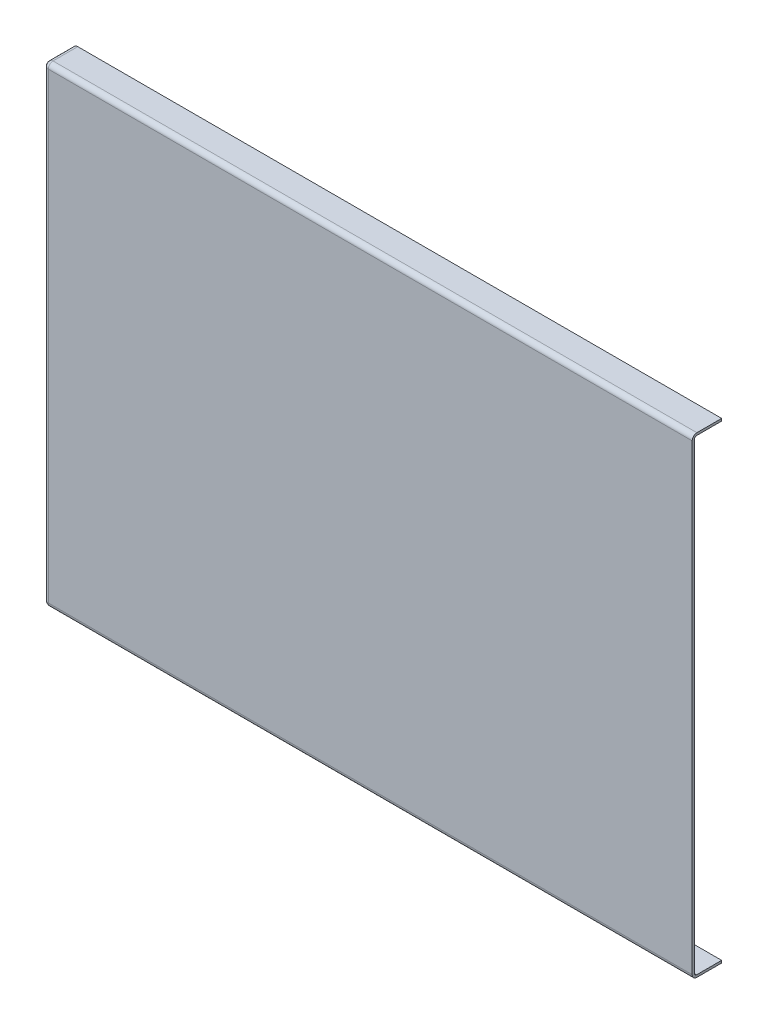
ISO-10303-21;
HEADER;
FILE_DESCRIPTION(('STEP AP214'),'2;1');
FILE_NAME('part.step','',(''),(''),'','','');
FILE_SCHEMA(('AUTOMOTIVE_DESIGN { 1 0 10303 214 1 1 1 1 }'));
ENDSEC;
DATA;
#1=APPLICATION_CONTEXT('core data for automotive mechanical design processes');
#2=APPLICATION_PROTOCOL_DEFINITION('international standard','automotive_design',2000,#1);
#3=PRODUCT_CONTEXT('',#1,'mechanical');
#4=PRODUCT('Part','Part','',(#3));
#5=PRODUCT_RELATED_PRODUCT_CATEGORY('part','',(#4));
#6=PRODUCT_DEFINITION_FORMATION('','',#4);
#7=PRODUCT_DEFINITION_CONTEXT('part definition',#1,'design');
#8=PRODUCT_DEFINITION('design','',#6,#7);
#9=PRODUCT_DEFINITION_SHAPE('','',#8);
#10=(LENGTH_UNIT() NAMED_UNIT(*) SI_UNIT(.MILLI.,.METRE.));
#11=(NAMED_UNIT(*) PLANE_ANGLE_UNIT() SI_UNIT($,.RADIAN.));
#12=(NAMED_UNIT(*) SI_UNIT($,.STERADIAN.) SOLID_ANGLE_UNIT());
#13=UNCERTAINTY_MEASURE_WITH_UNIT(LENGTH_MEASURE(1.E-05),#10,'distance_accuracy_value','');
#14=(GEOMETRIC_REPRESENTATION_CONTEXT(3) GLOBAL_UNCERTAINTY_ASSIGNED_CONTEXT((#13)) GLOBAL_UNIT_ASSIGNED_CONTEXT((#10,
#11,#12)) REPRESENTATION_CONTEXT('',''));
#15=CARTESIAN_POINT('',(0.,0.,0.));
#16=DIRECTION('',(0.,0.,1.));
#17=DIRECTION('',(1.,0.,0.));
#18=AXIS2_PLACEMENT_3D('',#15,#16,#17);
#19=CARTESIAN_POINT('',(0.,400.,-25.));
#20=DIRECTION('',(0.,0.,-1.));
#21=DIRECTION('',(-1.,0.,0.));
#22=AXIS2_PLACEMENT_3D('',#19,#20,#21);
#23=PLANE('',#22);
#24=DIRECTION('',(0.,1.,0.));
#25=VECTOR('',#24,1.);
#26=CARTESIAN_POINT('',(550.,0.,-25.));
#27=LINE('',#26,#25);
#28=CARTESIAN_POINT('',(550.,398.,-25.));
#29=VERTEX_POINT('',#28);
#30=CARTESIAN_POINT('',(550.,400.,-25.));
#31=VERTEX_POINT('',#30);
#32=EDGE_CURVE('E220',#29,#31,#27,.T.);
#33=ORIENTED_EDGE('',*,*,#32,.F.);
#34=DIRECTION('',(-1.,0.,0.));
#35=VECTOR('',#34,1.);
#36=CARTESIAN_POINT('',(0.,398.,-25.));
#37=LINE('',#36,#35);
#38=CARTESIAN_POINT('',(4.,398.,-25.));
#39=VERTEX_POINT('',#38);
#40=EDGE_CURVE('E197',#29,#39,#37,.T.);
#41=ORIENTED_EDGE('',*,*,#40,.T.);
#42=CARTESIAN_POINT('',(4.,396.,-25.));
#43=DIRECTION('',(0.,0.,-1.));
#44=DIRECTION('',(-1.,0.,0.));
#45=AXIS2_PLACEMENT_3D('',#42,#43,#44);
#46=CIRCLE('',#45,2.);
#47=CARTESIAN_POINT('',(2.,396.,-25.));
#48=VERTEX_POINT('',#47);
#49=EDGE_CURVE('E194',#48,#39,#46,.T.);
#50=ORIENTED_EDGE('',*,*,#49,.F.);
#51=DIRECTION('',(0.,-1.,0.));
#52=VECTOR('',#51,1.);
#53=CARTESIAN_POINT('',(2.,0.,-25.));
#54=LINE('',#53,#52);
#55=CARTESIAN_POINT('',(2.,4.,-25.));
#56=VERTEX_POINT('',#55);
#57=EDGE_CURVE('E166',#48,#56,#54,.T.);
#58=ORIENTED_EDGE('',*,*,#57,.T.);
#59=CARTESIAN_POINT('',(4.,4.,-25.));
#60=DIRECTION('',(0.,0.,-1.));
#61=DIRECTION('',(-1.,0.,0.));
#62=AXIS2_PLACEMENT_3D('',#59,#60,#61);
#63=CIRCLE('',#62,2.);
#64=CARTESIAN_POINT('',(4.,2.,-25.));
#65=VERTEX_POINT('',#64);
#66=EDGE_CURVE('E170',#65,#56,#63,.T.);
#67=ORIENTED_EDGE('',*,*,#66,.F.);
#68=DIRECTION('',(1.,0.,0.));
#69=VECTOR('',#68,1.);
#70=CARTESIAN_POINT('',(0.,2.,-25.));
#71=LINE('',#70,#69);
#72=CARTESIAN_POINT('',(550.,2.,-25.));
#73=VERTEX_POINT('',#72);
#74=EDGE_CURVE('E50',#65,#73,#71,.T.);
#75=ORIENTED_EDGE('',*,*,#74,.T.);
#76=CARTESIAN_POINT('',(550.,0.,-25.));
#77=VERTEX_POINT('',#76);
#78=EDGE_CURVE('E221',#77,#73,#27,.T.);
#79=ORIENTED_EDGE('',*,*,#78,.F.);
#80=DIRECTION('',(1.,0.,0.));
#81=VECTOR('',#80,1.);
#82=CARTESIAN_POINT('',(0.,0.,-25.));
#83=LINE('',#82,#81);
#84=CARTESIAN_POINT('',(4.,0.,-25.));
#85=VERTEX_POINT('',#84);
#86=EDGE_CURVE('E217',#85,#77,#83,.T.);
#87=ORIENTED_EDGE('',*,*,#86,.F.);
#88=CARTESIAN_POINT('',(4.,4.,-25.));
#89=DIRECTION('',(0.,0.,-1.));
#90=DIRECTION('',(-1.,0.,0.));
#91=AXIS2_PLACEMENT_3D('',#88,#89,#90);
#92=CIRCLE('',#91,4.);
#93=CARTESIAN_POINT('',(0.,4.,-25.));
#94=VERTEX_POINT('',#93);
#95=EDGE_CURVE('E255',#85,#94,#92,.T.);
#96=ORIENTED_EDGE('',*,*,#95,.T.);
#97=DIRECTION('',(0.,-1.,0.));
#98=VECTOR('',#97,1.);
#99=CARTESIAN_POINT('',(0.,0.,-25.));
#100=LINE('',#99,#98);
#101=CARTESIAN_POINT('',(0.,396.,-25.));
#102=VERTEX_POINT('',#101);
#103=EDGE_CURVE('E214',#102,#94,#100,.T.);
#104=ORIENTED_EDGE('',*,*,#103,.F.);
#105=CARTESIAN_POINT('',(4.,396.,-25.));
#106=DIRECTION('',(0.,0.,-1.));
#107=DIRECTION('',(-1.,0.,0.));
#108=AXIS2_PLACEMENT_3D('',#105,#106,#107);
#109=CIRCLE('',#108,4.);
#110=CARTESIAN_POINT('',(4.,400.,-25.));
#111=VERTEX_POINT('',#110);
#112=EDGE_CURVE('E257',#102,#111,#109,.T.);
#113=ORIENTED_EDGE('',*,*,#112,.T.);
#114=DIRECTION('',(-1.,0.,0.));
#115=VECTOR('',#114,1.);
#116=CARTESIAN_POINT('',(0.,400.,-25.));
#117=LINE('',#116,#115);
#118=EDGE_CURVE('E224',#31,#111,#117,.T.);
#119=ORIENTED_EDGE('',*,*,#118,.F.);
#120=EDGE_LOOP('',(#33,#41,#50,#58,#67,#75,#79,#87,#96,#104,#113,#119));
#121=FACE_BOUND('',#120,.T.);
#122=ADVANCED_FACE('F33',(#121),#23,.T.);
#123=CARTESIAN_POINT('',(0.,0.,-25.));
#124=DIRECTION('',(-1.,0.,0.));
#125=DIRECTION('',(0.,0.,1.));
#126=AXIS2_PLACEMENT_3D('',#123,#124,#125);
#127=PLANE('',#126);
#128=DIRECTION('',(0.,-1.,0.));
#129=VECTOR('',#128,1.);
#130=CARTESIAN_POINT('',(0.,400.,-4.));
#131=LINE('',#130,#129);
#132=CARTESIAN_POINT('',(0.,4.,-4.));
#133=VERTEX_POINT('',#132);
#134=CARTESIAN_POINT('',(0.,396.,-4.));
#135=VERTEX_POINT('',#134);
#136=EDGE_CURVE('E249',#133,#135,#131,.F.);
#137=ORIENTED_EDGE('',*,*,#136,.T.);
#138=DIRECTION('',(0.,0.,1.));
#139=VECTOR('',#138,1.);
#140=CARTESIAN_POINT('',(0.,396.,-25.));
#141=LINE('',#140,#139);
#142=EDGE_CURVE('E253',#135,#102,#141,.F.);
#143=ORIENTED_EDGE('',*,*,#142,.T.);
#144=ORIENTED_EDGE('',*,*,#103,.T.);
#145=DIRECTION('',(0.,0.,1.));
#146=VECTOR('',#145,1.);
#147=CARTESIAN_POINT('',(0.,4.,-25.));
#148=LINE('',#147,#146);
#149=EDGE_CURVE('E251',#94,#133,#148,.T.);
#150=ORIENTED_EDGE('',*,*,#149,.T.);
#151=EDGE_LOOP('',(#137,#143,#144,#150));
#152=FACE_BOUND('',#151,.T.);
#153=ADVANCED_FACE('F288',(#152),#127,.T.);
#154=CARTESIAN_POINT('',(0.,400.,-25.));
#155=DIRECTION('',(0.,1.,0.));
#156=DIRECTION('',(0.,0.,1.));
#157=AXIS2_PLACEMENT_3D('',#154,#155,#156);
#158=PLANE('',#157);
#159=DIRECTION('',(0.,0.,1.));
#160=VECTOR('',#159,1.);
#161=CARTESIAN_POINT('',(4.,400.,-25.));
#162=LINE('',#161,#160);
#163=CARTESIAN_POINT('',(4.,400.,-4.));
#164=VERTEX_POINT('',#163);
#165=EDGE_CURVE('E241',#111,#164,#162,.T.);
#166=ORIENTED_EDGE('',*,*,#165,.T.);
#167=DIRECTION('',(-1.,0.,0.));
#168=VECTOR('',#167,1.);
#169=CARTESIAN_POINT('',(550.,400.,-4.));
#170=LINE('',#169,#168);
#171=CARTESIAN_POINT('',(550.,400.,-4.));
#172=VERTEX_POINT('',#171);
#173=EDGE_CURVE('E243',#164,#172,#170,.F.);
#174=ORIENTED_EDGE('',*,*,#173,.T.);
#175=DIRECTION('',(0.,0.,1.));
#176=VECTOR('',#175,1.);
#177=CARTESIAN_POINT('',(550.,400.,-25.));
#178=LINE('',#177,#176);
#179=EDGE_CURVE('E230',#31,#172,#178,.T.);
#180=ORIENTED_EDGE('',*,*,#179,.F.);
#181=ORIENTED_EDGE('',*,*,#118,.T.);
#182=EDGE_LOOP('',(#166,#174,#180,#181));
#183=FACE_BOUND('',#182,.T.);
#184=ADVANCED_FACE('F302',(#183),#158,.T.);
#185=CARTESIAN_POINT('',(550.,0.,-25.));
#186=DIRECTION('',(1.,0.,0.));
#187=DIRECTION('',(0.,0.,-1.));
#188=AXIS2_PLACEMENT_3D('',#185,#186,#187);
#189=PLANE('',#188);
#190=DIRECTION('',(0.,0.,1.));
#191=VECTOR('',#190,1.);
#192=CARTESIAN_POINT('',(550.,398.,-25.));
#193=LINE('',#192,#191);
#194=CARTESIAN_POINT('',(550.,398.,-4.));
#195=VERTEX_POINT('',#194);
#196=EDGE_CURVE('E201',#29,#195,#193,.T.);
#197=ORIENTED_EDGE('',*,*,#196,.F.);
#198=ORIENTED_EDGE('',*,*,#32,.T.);
#199=ORIENTED_EDGE('',*,*,#179,.T.);
#200=CARTESIAN_POINT('',(550.,396.,-4.));
#201=DIRECTION('',(1.,0.,0.));
#202=DIRECTION('',(0.,0.,-1.));
#203=AXIS2_PLACEMENT_3D('',#200,#201,#202);
#204=CIRCLE('',#203,4.);
#205=CARTESIAN_POINT('',(550.,396.,0.));
#206=VERTEX_POINT('',#205);
#207=EDGE_CURVE('E247',#172,#206,#204,.T.);
#208=ORIENTED_EDGE('',*,*,#207,.T.);
#209=DIRECTION('',(0.,1.,0.));
#210=VECTOR('',#209,1.);
#211=CARTESIAN_POINT('',(550.,0.,0.));
#212=LINE('',#211,#210);
#213=CARTESIAN_POINT('',(550.,4.,0.));
#214=VERTEX_POINT('',#213);
#215=EDGE_CURVE('E218',#214,#206,#212,.T.);
#216=ORIENTED_EDGE('',*,*,#215,.F.);
#217=CARTESIAN_POINT('',(550.,4.,-4.));
#218=DIRECTION('',(1.,0.,0.));
#219=DIRECTION('',(0.,0.,-1.));
#220=AXIS2_PLACEMENT_3D('',#217,#218,#219);
#221=CIRCLE('',#220,4.);
#222=CARTESIAN_POINT('',(550.,0.,-4.));
#223=VERTEX_POINT('',#222);
#224=EDGE_CURVE('E245',#214,#223,#221,.T.);
#225=ORIENTED_EDGE('',*,*,#224,.T.);
#226=DIRECTION('',(0.,0.,1.));
#227=VECTOR('',#226,1.);
#228=CARTESIAN_POINT('',(550.,0.,-25.));
#229=LINE('',#228,#227);
#230=EDGE_CURVE('E227',#77,#223,#229,.T.);
#231=ORIENTED_EDGE('',*,*,#230,.F.);
#232=ORIENTED_EDGE('',*,*,#78,.T.);
#233=DIRECTION('',(0.,0.,1.));
#234=VECTOR('',#233,1.);
#235=CARTESIAN_POINT('',(550.,2.,-25.));
#236=LINE('',#235,#234);
#237=CARTESIAN_POINT('',(550.,2.,-4.));
#238=VERTEX_POINT('',#237);
#239=EDGE_CURVE('E200',#73,#238,#236,.T.);
#240=ORIENTED_EDGE('',*,*,#239,.T.);
#241=CARTESIAN_POINT('',(550.,4.,-4.));
#242=DIRECTION('',(1.,0.,0.));
#243=DIRECTION('',(0.,0.,-1.));
#244=AXIS2_PLACEMENT_3D('',#241,#242,#243);
#245=CIRCLE('',#244,2.);
#246=CARTESIAN_POINT('',(550.,4.,-2.));
#247=VERTEX_POINT('',#246);
#248=EDGE_CURVE('E190',#247,#238,#245,.T.);
#249=ORIENTED_EDGE('',*,*,#248,.F.);
#250=DIRECTION('',(0.,1.,0.));
#251=VECTOR('',#250,1.);
#252=CARTESIAN_POINT('',(550.,0.,-2.));
#253=LINE('',#252,#251);
#254=CARTESIAN_POINT('',(550.,396.,-2.));
#255=VERTEX_POINT('',#254);
#256=EDGE_CURVE('E193',#247,#255,#253,.T.);
#257=ORIENTED_EDGE('',*,*,#256,.T.);
#258=CARTESIAN_POINT('',(550.,396.,-4.));
#259=DIRECTION('',(1.,0.,0.));
#260=DIRECTION('',(0.,0.,-1.));
#261=AXIS2_PLACEMENT_3D('',#258,#259,#260);
#262=CIRCLE('',#261,2.);
#263=EDGE_CURVE('E160',#195,#255,#262,.T.);
#264=ORIENTED_EDGE('',*,*,#263,.F.);
#265=EDGE_LOOP('',(#197,#198,#199,#208,#216,#225,#231,#232,#240,#249,#257,#264));
#266=FACE_BOUND('',#265,.T.);
#267=ADVANCED_FACE('F306',(#266),#189,.T.);
#268=CARTESIAN_POINT('',(0.,0.,-25.));
#269=DIRECTION('',(0.,-1.,0.));
#270=DIRECTION('',(0.,0.,-1.));
#271=AXIS2_PLACEMENT_3D('',#268,#269,#270);
#272=PLANE('',#271);
#273=DIRECTION('',(1.,0.,0.));
#274=VECTOR('',#273,1.);
#275=CARTESIAN_POINT('',(0.,0.,-4.));
#276=LINE('',#275,#274);
#277=CARTESIAN_POINT('',(4.,0.,-4.));
#278=VERTEX_POINT('',#277);
#279=EDGE_CURVE('E42',#223,#278,#276,.F.);
#280=ORIENTED_EDGE('',*,*,#279,.T.);
#281=DIRECTION('',(0.,0.,1.));
#282=VECTOR('',#281,1.);
#283=CARTESIAN_POINT('',(4.,0.,-25.));
#284=LINE('',#283,#282);
#285=EDGE_CURVE('E11',#278,#85,#284,.F.);
#286=ORIENTED_EDGE('',*,*,#285,.T.);
#287=ORIENTED_EDGE('',*,*,#86,.T.);
#288=ORIENTED_EDGE('',*,*,#230,.T.);
#289=EDGE_LOOP('',(#280,#286,#287,#288));
#290=FACE_BOUND('',#289,.T.);
#291=ADVANCED_FACE('F323',(#290),#272,.T.);
#292=CARTESIAN_POINT('',(0.,400.,0.));
#293=DIRECTION('',(0.,0.,-1.));
#294=DIRECTION('',(-1.,0.,0.));
#295=AXIS2_PLACEMENT_3D('',#292,#293,#294);
#296=PLANE('',#295);
#297=ORIENTED_EDGE('',*,*,#215,.T.);
#298=DIRECTION('',(-1.,0.,0.));
#299=VECTOR('',#298,1.);
#300=CARTESIAN_POINT('',(0.,396.,0.));
#301=LINE('',#300,#299);
#302=CARTESIAN_POINT('',(4.,396.,0.));
#303=VERTEX_POINT('',#302);
#304=EDGE_CURVE('E238',#206,#303,#301,.T.);
#305=ORIENTED_EDGE('',*,*,#304,.T.);
#306=DIRECTION('',(0.,-1.,0.));
#307=VECTOR('',#306,1.);
#308=CARTESIAN_POINT('',(4.,0.,0.));
#309=LINE('',#308,#307);
#310=CARTESIAN_POINT('',(4.,4.,0.));
#311=VERTEX_POINT('',#310);
#312=EDGE_CURVE('E233',#303,#311,#309,.T.);
#313=ORIENTED_EDGE('',*,*,#312,.T.);
#314=DIRECTION('',(1.,0.,0.));
#315=VECTOR('',#314,1.);
#316=CARTESIAN_POINT('',(550.,4.,0.));
#317=LINE('',#316,#315);
#318=EDGE_CURVE('E236',#311,#214,#317,.T.);
#319=ORIENTED_EDGE('',*,*,#318,.T.);
#320=EDGE_LOOP('',(#297,#305,#313,#319));
#321=FACE_BOUND('',#320,.T.);
#322=ADVANCED_FACE('F313',(#321),#296,.F.);
#323=CARTESIAN_POINT('',(0.,4.,-4.));
#324=DIRECTION('',(-1.,0.,0.));
#325=DIRECTION('',(0.,0.,1.));
#326=AXIS2_PLACEMENT_3D('',#323,#324,#325);
#327=CYLINDRICAL_SURFACE('',#326,4.);
#328=ORIENTED_EDGE('',*,*,#224,.F.);
#329=ORIENTED_EDGE('',*,*,#318,.F.);
#330=CARTESIAN_POINT('',(4.,4.,-4.));
#331=DIRECTION('',(-1.,0.,0.));
#332=DIRECTION('',(0.,0.,1.));
#333=AXIS2_PLACEMENT_3D('',#330,#331,#332);
#334=CIRCLE('',#333,4.);
#335=EDGE_CURVE('E37',#278,#311,#334,.T.);
#336=ORIENTED_EDGE('',*,*,#335,.F.);
#337=ORIENTED_EDGE('',*,*,#279,.F.);
#338=EDGE_LOOP('',(#328,#329,#336,#337));
#339=FACE_BOUND('',#338,.T.);
#340=ADVANCED_FACE('F35',(#339),#327,.T.);
#341=CARTESIAN_POINT('',(4.,4.,-25.));
#342=DIRECTION('',(0.,0.,1.));
#343=DIRECTION('',(1.,0.,0.));
#344=AXIS2_PLACEMENT_3D('',#341,#342,#343);
#345=CYLINDRICAL_SURFACE('',#344,4.);
#346=ORIENTED_EDGE('',*,*,#95,.F.);
#347=ORIENTED_EDGE('',*,*,#285,.F.);
#348=CARTESIAN_POINT('',(4.,4.,-4.));
#349=DIRECTION('',(0.,0.,1.));
#350=DIRECTION('',(1.,0.,0.));
#351=AXIS2_PLACEMENT_3D('',#348,#349,#350);
#352=CIRCLE('',#351,4.);
#353=EDGE_CURVE('E271',#133,#278,#352,.T.);
#354=ORIENTED_EDGE('',*,*,#353,.F.);
#355=ORIENTED_EDGE('',*,*,#149,.F.);
#356=EDGE_LOOP('',(#346,#347,#354,#355));
#357=FACE_BOUND('',#356,.T.);
#358=ADVANCED_FACE('F317',(#357),#345,.T.);
#359=CARTESIAN_POINT('',(4.,4.,-4.));
#360=DIRECTION('',(0.,0.,1.));
#361=DIRECTION('',(1.,0.,0.));
#362=AXIS2_PLACEMENT_3D('',#359,#360,#361);
#363=SPHERICAL_SURFACE('',#362,4.);
#364=ORIENTED_EDGE('',*,*,#353,.T.);
#365=ORIENTED_EDGE('',*,*,#335,.T.);
#366=CARTESIAN_POINT('',(4.,4.,-4.));
#367=DIRECTION('',(0.,-1.,0.));
#368=DIRECTION('',(1.,0.,0.));
#369=AXIS2_PLACEMENT_3D('',#366,#367,#368);
#370=CIRCLE('',#369,4.);
#371=EDGE_CURVE('E269',#133,#311,#370,.F.);
#372=ORIENTED_EDGE('',*,*,#371,.F.);
#373=EDGE_LOOP('',(#364,#365,#372));
#374=FACE_BOUND('',#373,.T.);
#375=ADVANCED_FACE('F278',(#374),#363,.T.);
#376=CARTESIAN_POINT('',(4.,400.,-4.));
#377=DIRECTION('',(0.,1.,0.));
#378=DIRECTION('',(0.,0.,1.));
#379=AXIS2_PLACEMENT_3D('',#376,#377,#378);
#380=CYLINDRICAL_SURFACE('',#379,4.);
#381=ORIENTED_EDGE('',*,*,#371,.T.);
#382=ORIENTED_EDGE('',*,*,#312,.F.);
#383=CARTESIAN_POINT('',(4.,396.,-4.));
#384=DIRECTION('',(0.,1.,0.));
#385=DIRECTION('',(0.,0.,1.));
#386=AXIS2_PLACEMENT_3D('',#383,#384,#385);
#387=CIRCLE('',#386,4.);
#388=EDGE_CURVE('E266',#135,#303,#387,.T.);
#389=ORIENTED_EDGE('',*,*,#388,.F.);
#390=ORIENTED_EDGE('',*,*,#136,.F.);
#391=EDGE_LOOP('',(#381,#382,#389,#390));
#392=FACE_BOUND('',#391,.T.);
#393=ADVANCED_FACE('F284',(#392),#380,.T.);
#394=CARTESIAN_POINT('',(4.,396.,-25.));
#395=DIRECTION('',(0.,0.,1.));
#396=DIRECTION('',(1.,0.,0.));
#397=AXIS2_PLACEMENT_3D('',#394,#395,#396);
#398=CYLINDRICAL_SURFACE('',#397,4.);
#399=ORIENTED_EDGE('',*,*,#112,.F.);
#400=ORIENTED_EDGE('',*,*,#142,.F.);
#401=CARTESIAN_POINT('',(4.,396.,-4.));
#402=DIRECTION('',(0.,0.,1.));
#403=DIRECTION('',(1.,0.,0.));
#404=AXIS2_PLACEMENT_3D('',#401,#402,#403);
#405=CIRCLE('',#404,4.);
#406=EDGE_CURVE('E262',#164,#135,#405,.T.);
#407=ORIENTED_EDGE('',*,*,#406,.F.);
#408=ORIENTED_EDGE('',*,*,#165,.F.);
#409=EDGE_LOOP('',(#399,#400,#407,#408));
#410=FACE_BOUND('',#409,.T.);
#411=ADVANCED_FACE('F294',(#410),#398,.T.);
#412=CARTESIAN_POINT('',(4.,396.,-4.));
#413=DIRECTION('',(0.,0.,1.));
#414=DIRECTION('',(1.,0.,0.));
#415=AXIS2_PLACEMENT_3D('',#412,#413,#414);
#416=SPHERICAL_SURFACE('',#415,4.);
#417=ORIENTED_EDGE('',*,*,#406,.T.);
#418=ORIENTED_EDGE('',*,*,#388,.T.);
#419=CARTESIAN_POINT('',(4.,396.,-4.));
#420=DIRECTION('',(-1.,0.,0.));
#421=DIRECTION('',(0.,0.,1.));
#422=AXIS2_PLACEMENT_3D('',#419,#420,#421);
#423=CIRCLE('',#422,4.);
#424=EDGE_CURVE('E260',#164,#303,#423,.F.);
#425=ORIENTED_EDGE('',*,*,#424,.F.);
#426=EDGE_LOOP('',(#417,#418,#425));
#427=FACE_BOUND('',#426,.T.);
#428=ADVANCED_FACE('F343',(#427),#416,.T.);
#429=CARTESIAN_POINT('',(0.,396.,-4.));
#430=DIRECTION('',(1.,0.,0.));
#431=DIRECTION('',(0.,0.,-1.));
#432=AXIS2_PLACEMENT_3D('',#429,#430,#431);
#433=CYLINDRICAL_SURFACE('',#432,4.);
#434=ORIENTED_EDGE('',*,*,#207,.F.);
#435=ORIENTED_EDGE('',*,*,#173,.F.);
#436=ORIENTED_EDGE('',*,*,#424,.T.);
#437=ORIENTED_EDGE('',*,*,#304,.F.);
#438=EDGE_LOOP('',(#434,#435,#436,#437));
#439=FACE_BOUND('',#438,.T.);
#440=ADVANCED_FACE('F310',(#439),#433,.T.);
#441=CARTESIAN_POINT('',(2.,0.,-25.));
#442=DIRECTION('',(-1.,0.,0.));
#443=DIRECTION('',(0.,0.,1.));
#444=AXIS2_PLACEMENT_3D('',#441,#442,#443);
#445=PLANE('',#444);
#446=DIRECTION('',(0.,1.,0.));
#447=VECTOR('',#446,1.);
#448=CARTESIAN_POINT('',(2.,0.,-4.));
#449=LINE('',#448,#447);
#450=CARTESIAN_POINT('',(2.,4.,-4.));
#451=VERTEX_POINT('',#450);
#452=CARTESIAN_POINT('',(2.,396.,-4.));
#453=VERTEX_POINT('',#452);
#454=EDGE_CURVE('E149',#451,#453,#449,.T.);
#455=ORIENTED_EDGE('',*,*,#454,.F.);
#456=DIRECTION('',(0.,0.,1.));
#457=VECTOR('',#456,1.);
#458=CARTESIAN_POINT('',(2.,4.,-25.));
#459=LINE('',#458,#457);
#460=EDGE_CURVE('E159',#56,#451,#459,.T.);
#461=ORIENTED_EDGE('',*,*,#460,.F.);
#462=ORIENTED_EDGE('',*,*,#57,.F.);
#463=DIRECTION('',(0.,0.,1.));
#464=VECTOR('',#463,1.);
#465=CARTESIAN_POINT('',(2.,396.,-25.));
#466=LINE('',#465,#464);
#467=EDGE_CURVE('E163',#453,#48,#466,.F.);
#468=ORIENTED_EDGE('',*,*,#467,.F.);
#469=EDGE_LOOP('',(#455,#461,#462,#468));
#470=FACE_BOUND('',#469,.T.);
#471=ADVANCED_FACE('F164',(#470),#445,.F.);
#472=CARTESIAN_POINT('',(0.,398.,-25.));
#473=DIRECTION('',(0.,1.,0.));
#474=DIRECTION('',(0.,0.,1.));
#475=AXIS2_PLACEMENT_3D('',#472,#473,#474);
#476=PLANE('',#475);
#477=DIRECTION('',(0.,0.,1.));
#478=VECTOR('',#477,1.);
#479=CARTESIAN_POINT('',(4.,398.,-25.));
#480=LINE('',#479,#478);
#481=CARTESIAN_POINT('',(4.,398.,-4.));
#482=VERTEX_POINT('',#481);
#483=EDGE_CURVE('E182',#39,#482,#480,.T.);
#484=ORIENTED_EDGE('',*,*,#483,.F.);
#485=ORIENTED_EDGE('',*,*,#40,.F.);
#486=ORIENTED_EDGE('',*,*,#196,.T.);
#487=DIRECTION('',(1.,0.,0.));
#488=VECTOR('',#487,1.);
#489=CARTESIAN_POINT('',(0.,398.,-4.));
#490=LINE('',#489,#488);
#491=EDGE_CURVE('E188',#482,#195,#490,.T.);
#492=ORIENTED_EDGE('',*,*,#491,.F.);
#493=EDGE_LOOP('',(#484,#485,#486,#492));
#494=FACE_BOUND('',#493,.T.);
#495=ADVANCED_FACE('F378',(#494),#476,.F.);
#496=CARTESIAN_POINT('',(0.,2.,-25.));
#497=DIRECTION('',(0.,-1.,0.));
#498=DIRECTION('',(0.,0.,-1.));
#499=AXIS2_PLACEMENT_3D('',#496,#497,#498);
#500=PLANE('',#499);
#501=DIRECTION('',(1.,0.,0.));
#502=VECTOR('',#501,1.);
#503=CARTESIAN_POINT('',(0.,2.,-4.));
#504=LINE('',#503,#502);
#505=CARTESIAN_POINT('',(4.,2.,-4.));
#506=VERTEX_POINT('',#505);
#507=EDGE_CURVE('E196',#238,#506,#504,.F.);
#508=ORIENTED_EDGE('',*,*,#507,.F.);
#509=ORIENTED_EDGE('',*,*,#239,.F.);
#510=ORIENTED_EDGE('',*,*,#74,.F.);
#511=DIRECTION('',(0.,0.,-1.));
#512=VECTOR('',#511,1.);
#513=CARTESIAN_POINT('',(4.,2.,-25.));
#514=LINE('',#513,#512);
#515=EDGE_CURVE('E263',#506,#65,#514,.T.);
#516=ORIENTED_EDGE('',*,*,#515,.F.);
#517=EDGE_LOOP('',(#508,#509,#510,#516));
#518=FACE_BOUND('',#517,.T.);
#519=ADVANCED_FACE('F386',(#518),#500,.F.);
#520=CARTESIAN_POINT('',(0.,400.,-2.));
#521=DIRECTION('',(0.,0.,-1.));
#522=DIRECTION('',(-1.,0.,0.));
#523=AXIS2_PLACEMENT_3D('',#520,#521,#522);
#524=PLANE('',#523);
#525=ORIENTED_EDGE('',*,*,#256,.F.);
#526=DIRECTION('',(-1.,0.,0.));
#527=VECTOR('',#526,1.);
#528=CARTESIAN_POINT('',(0.,4.,-2.));
#529=LINE('',#528,#527);
#530=CARTESIAN_POINT('',(4.,4.,-2.));
#531=VERTEX_POINT('',#530);
#532=EDGE_CURVE('E530',#531,#247,#529,.F.);
#533=ORIENTED_EDGE('',*,*,#532,.F.);
#534=DIRECTION('',(0.,1.,0.));
#535=VECTOR('',#534,1.);
#536=CARTESIAN_POINT('',(4.,400.,-2.));
#537=LINE('',#536,#535);
#538=CARTESIAN_POINT('',(4.,396.,-2.));
#539=VERTEX_POINT('',#538);
#540=EDGE_CURVE('E204',#539,#531,#537,.F.);
#541=ORIENTED_EDGE('',*,*,#540,.F.);
#542=DIRECTION('',(-1.,0.,0.));
#543=VECTOR('',#542,1.);
#544=CARTESIAN_POINT('',(0.,396.,-2.));
#545=LINE('',#544,#543);
#546=EDGE_CURVE('E189',#255,#539,#545,.T.);
#547=ORIENTED_EDGE('',*,*,#546,.F.);
#548=EDGE_LOOP('',(#525,#533,#541,#547));
#549=FACE_BOUND('',#548,.T.);
#550=ADVANCED_FACE('F394',(#549),#524,.T.);
#551=CARTESIAN_POINT('',(0.,4.,-4.));
#552=DIRECTION('',(-1.,0.,0.));
#553=DIRECTION('',(0.,0.,1.));
#554=AXIS2_PLACEMENT_3D('',#551,#552,#553);
#555=CYLINDRICAL_SURFACE('',#554,2.);
#556=ORIENTED_EDGE('',*,*,#248,.T.);
#557=ORIENTED_EDGE('',*,*,#507,.T.);
#558=CARTESIAN_POINT('',(4.,4.,-4.));
#559=DIRECTION('',(-1.,0.,0.));
#560=DIRECTION('',(0.,-1.,0.));
#561=AXIS2_PLACEMENT_3D('',#558,#559,#560);
#562=CIRCLE('',#561,2.);
#563=EDGE_CURVE('E208',#506,#531,#562,.T.);
#564=ORIENTED_EDGE('',*,*,#563,.T.);
#565=ORIENTED_EDGE('',*,*,#532,.T.);
#566=EDGE_LOOP('',(#556,#557,#564,#565));
#567=FACE_BOUND('',#566,.T.);
#568=ADVANCED_FACE('F401',(#567),#555,.F.);
#569=CARTESIAN_POINT('',(4.,4.,-25.));
#570=DIRECTION('',(0.,0.,1.));
#571=DIRECTION('',(1.,0.,0.));
#572=AXIS2_PLACEMENT_3D('',#569,#570,#571);
#573=CYLINDRICAL_SURFACE('',#572,2.);
#574=ORIENTED_EDGE('',*,*,#66,.T.);
#575=ORIENTED_EDGE('',*,*,#460,.T.);
#576=CARTESIAN_POINT('',(4.,4.,-4.));
#577=DIRECTION('',(0.,0.,1.));
#578=DIRECTION('',(1.,0.,0.));
#579=AXIS2_PLACEMENT_3D('',#576,#577,#578);
#580=CIRCLE('',#579,2.);
#581=EDGE_CURVE('E539',#451,#506,#580,.T.);
#582=ORIENTED_EDGE('',*,*,#581,.T.);
#583=ORIENTED_EDGE('',*,*,#515,.T.);
#584=EDGE_LOOP('',(#574,#575,#582,#583));
#585=FACE_BOUND('',#584,.T.);
#586=ADVANCED_FACE('F409',(#585),#573,.F.);
#587=CARTESIAN_POINT('',(4.,4.,-4.));
#588=DIRECTION('',(0.,0.,1.));
#589=DIRECTION('',(1.,0.,0.));
#590=AXIS2_PLACEMENT_3D('',#587,#588,#589);
#591=SPHERICAL_SURFACE('',#590,2.);
#592=ORIENTED_EDGE('',*,*,#581,.F.);
#593=CARTESIAN_POINT('',(4.,4.,-4.));
#594=DIRECTION('',(0.,1.,0.));
#595=DIRECTION('',(0.,0.,1.));
#596=AXIS2_PLACEMENT_3D('',#593,#594,#595);
#597=CIRCLE('',#596,2.);
#598=EDGE_CURVE('E156',#451,#531,#597,.T.);
#599=ORIENTED_EDGE('',*,*,#598,.T.);
#600=ORIENTED_EDGE('',*,*,#563,.F.);
#601=EDGE_LOOP('',(#592,#599,#600));
#602=FACE_BOUND('',#601,.T.);
#603=ADVANCED_FACE('F417',(#602),#591,.F.);
#604=CARTESIAN_POINT('',(4.,400.,-4.));
#605=DIRECTION('',(0.,1.,0.));
#606=DIRECTION('',(0.,0.,1.));
#607=AXIS2_PLACEMENT_3D('',#604,#605,#606);
#608=CYLINDRICAL_SURFACE('',#607,2.);
#609=ORIENTED_EDGE('',*,*,#598,.F.);
#610=ORIENTED_EDGE('',*,*,#454,.T.);
#611=CARTESIAN_POINT('',(4.,396.,-4.));
#612=DIRECTION('',(0.,1.,0.));
#613=DIRECTION('',(-1.,0.,0.));
#614=AXIS2_PLACEMENT_3D('',#611,#612,#613);
#615=CIRCLE('',#614,2.);
#616=EDGE_CURVE('E153',#453,#539,#615,.T.);
#617=ORIENTED_EDGE('',*,*,#616,.T.);
#618=ORIENTED_EDGE('',*,*,#540,.T.);
#619=EDGE_LOOP('',(#609,#610,#617,#618));
#620=FACE_BOUND('',#619,.T.);
#621=ADVANCED_FACE('F151',(#620),#608,.F.);
#622=CARTESIAN_POINT('',(4.,396.,-25.));
#623=DIRECTION('',(0.,0.,1.));
#624=DIRECTION('',(1.,0.,0.));
#625=AXIS2_PLACEMENT_3D('',#622,#623,#624);
#626=CYLINDRICAL_SURFACE('',#625,2.);
#627=ORIENTED_EDGE('',*,*,#49,.T.);
#628=ORIENTED_EDGE('',*,*,#483,.T.);
#629=CARTESIAN_POINT('',(4.,396.,-4.));
#630=DIRECTION('',(0.,0.,1.));
#631=DIRECTION('',(1.,0.,0.));
#632=AXIS2_PLACEMENT_3D('',#629,#630,#631);
#633=CIRCLE('',#632,2.);
#634=EDGE_CURVE('E175',#482,#453,#633,.T.);
#635=ORIENTED_EDGE('',*,*,#634,.T.);
#636=ORIENTED_EDGE('',*,*,#467,.T.);
#637=EDGE_LOOP('',(#627,#628,#635,#636));
#638=FACE_BOUND('',#637,.T.);
#639=ADVANCED_FACE('F180',(#638),#626,.F.);
#640=CARTESIAN_POINT('',(4.,396.,-4.));
#641=DIRECTION('',(0.,0.,1.));
#642=DIRECTION('',(1.,0.,0.));
#643=AXIS2_PLACEMENT_3D('',#640,#641,#642);
#644=SPHERICAL_SURFACE('',#643,2.);
#645=ORIENTED_EDGE('',*,*,#634,.F.);
#646=CARTESIAN_POINT('',(4.,396.,-4.));
#647=DIRECTION('',(1.,0.,0.));
#648=DIRECTION('',(0.,0.,-1.));
#649=AXIS2_PLACEMENT_3D('',#646,#647,#648);
#650=CIRCLE('',#649,2.);
#651=EDGE_CURVE('E178',#482,#539,#650,.T.);
#652=ORIENTED_EDGE('',*,*,#651,.T.);
#653=ORIENTED_EDGE('',*,*,#616,.F.);
#654=EDGE_LOOP('',(#645,#652,#653));
#655=FACE_BOUND('',#654,.T.);
#656=ADVANCED_FACE('F174',(#655),#644,.F.);
#657=CARTESIAN_POINT('',(0.,396.,-4.));
#658=DIRECTION('',(1.,0.,0.));
#659=DIRECTION('',(0.,0.,-1.));
#660=AXIS2_PLACEMENT_3D('',#657,#658,#659);
#661=CYLINDRICAL_SURFACE('',#660,2.);
#662=ORIENTED_EDGE('',*,*,#263,.T.);
#663=ORIENTED_EDGE('',*,*,#546,.T.);
#664=ORIENTED_EDGE('',*,*,#651,.F.);
#665=ORIENTED_EDGE('',*,*,#491,.T.);
#666=EDGE_LOOP('',(#662,#663,#664,#665));
#667=FACE_BOUND('',#666,.T.);
#668=ADVANCED_FACE('F332',(#667),#661,.F.);
#669=CLOSED_SHELL('',(#122,#153,#184,#267,#291,#322,#340,#358,#375,#393,#411,#428,#440,#471,
#495,#519,#550,#568,#586,#603,#621,#639,#656,#668));
#670=MANIFOLD_SOLID_BREP('B2',#669);
#671=ADVANCED_BREP_SHAPE_REPRESENTATION('',(#18,#670),#14);
#672=SHAPE_DEFINITION_REPRESENTATION(#9,#671);
ENDSEC;
END-ISO-10303-21;
